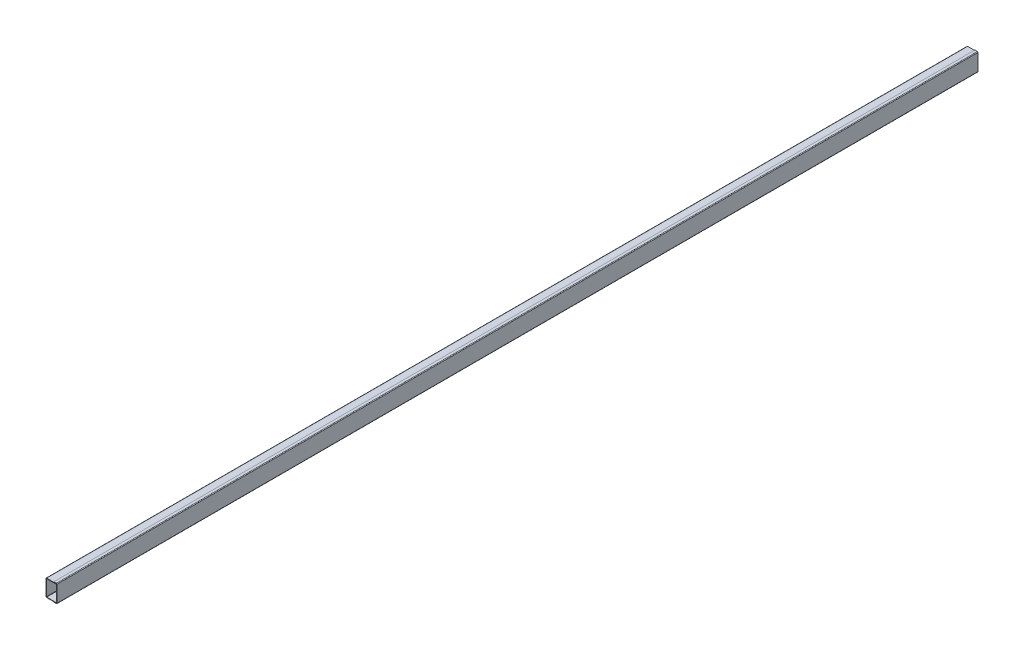
ISO-10303-21;
HEADER;
FILE_DESCRIPTION(('STEP AP214'),'2;1');
FILE_NAME('part.step','',(''),(''),'','','');
FILE_SCHEMA(('AUTOMOTIVE_DESIGN { 1 0 10303 214 1 1 1 1 }'));
ENDSEC;
DATA;
#1=APPLICATION_CONTEXT('core data for automotive mechanical design processes');
#2=APPLICATION_PROTOCOL_DEFINITION('international standard','automotive_design',2000,#1);
#3=PRODUCT_CONTEXT('',#1,'mechanical');
#4=PRODUCT('Part','Part','',(#3));
#5=PRODUCT_RELATED_PRODUCT_CATEGORY('part','',(#4));
#6=PRODUCT_DEFINITION_FORMATION('','',#4);
#7=PRODUCT_DEFINITION_CONTEXT('part definition',#1,'design');
#8=PRODUCT_DEFINITION('design','',#6,#7);
#9=PRODUCT_DEFINITION_SHAPE('','',#8);
#10=(LENGTH_UNIT() NAMED_UNIT(*) SI_UNIT(.MILLI.,.METRE.));
#11=(NAMED_UNIT(*) PLANE_ANGLE_UNIT() SI_UNIT($,.RADIAN.));
#12=(NAMED_UNIT(*) SI_UNIT($,.STERADIAN.) SOLID_ANGLE_UNIT());
#13=UNCERTAINTY_MEASURE_WITH_UNIT(LENGTH_MEASURE(1.E-05),#10,'distance_accuracy_value','');
#14=(GEOMETRIC_REPRESENTATION_CONTEXT(3) GLOBAL_UNCERTAINTY_ASSIGNED_CONTEXT((#13)) GLOBAL_UNIT_ASSIGNED_CONTEXT((#10,
#11,#12)) REPRESENTATION_CONTEXT('',''));
#15=CARTESIAN_POINT('',(0.,0.,0.));
#16=DIRECTION('',(0.,0.,1.));
#17=DIRECTION('',(1.,0.,0.));
#18=AXIS2_PLACEMENT_3D('',#15,#16,#17);
#19=CARTESIAN_POINT('',(52.,40.0000000000002,2185.));
#20=DIRECTION('',(0.,0.,-1.));
#21=DIRECTION('',(-1.,0.,0.));
#22=AXIS2_PLACEMENT_3D('',#19,#20,#21);
#23=PLANE('',#22);
#24=DIRECTION('',(1.,0.,0.));
#25=VECTOR('',#24,1.);
#26=CARTESIAN_POINT('',(50.0000000000002,-38.9999999999998,2185.));
#27=LINE('',#26,#25);
#28=CARTESIAN_POINT('',(50.0000000000002,-38.9999999999998,2185.));
#29=VERTEX_POINT('',#28);
#30=CARTESIAN_POINT('',(52.0000000000002,-38.9999999999998,2185.));
#31=VERTEX_POINT('',#30);
#32=EDGE_CURVE('E230',#29,#31,#27,.T.);
#33=ORIENTED_EDGE('',*,*,#32,.T.);
#34=DIRECTION('',(0.,-1.,0.));
#35=VECTOR('',#34,1.);
#36=CARTESIAN_POINT('',(52.,40.0000000000002,2185.));
#37=LINE('',#36,#35);
#38=CARTESIAN_POINT('',(52.,39.0000000000002,2185.));
#39=VERTEX_POINT('',#38);
#40=EDGE_CURVE('E99',#39,#31,#37,.T.);
#41=ORIENTED_EDGE('',*,*,#40,.F.);
#42=DIRECTION('',(1.,0.,0.));
#43=VECTOR('',#42,1.);
#44=CARTESIAN_POINT('',(50.0000000000001,39.0000000000002,2185.));
#45=LINE('',#44,#43);
#46=CARTESIAN_POINT('',(50.0000000000001,39.0000000000002,2185.));
#47=VERTEX_POINT('',#46);
#48=EDGE_CURVE('E288',#47,#39,#45,.T.);
#49=ORIENTED_EDGE('',*,*,#48,.F.);
#50=DIRECTION('',(0.,-1.,0.));
#51=VECTOR('',#50,1.);
#52=CARTESIAN_POINT('',(50.,40.0000000000002,2185.));
#53=LINE('',#52,#51);
#54=EDGE_CURVE('E290',#47,#29,#53,.T.);
#55=ORIENTED_EDGE('',*,*,#54,.T.);
#56=EDGE_LOOP('',(#33,#41,#49,#55));
#57=FACE_BOUND('',#56,.T.);
#58=ADVANCED_FACE('F91',(#57),#23,.F.);
#59=CARTESIAN_POINT('',(52.0000000000003,-39.9999999999998,-2185.));
#60=DIRECTION('',(0.,0.,1.));
#61=DIRECTION('',(1.,0.,0.));
#62=AXIS2_PLACEMENT_3D('',#59,#60,#61);
#63=PLANE('',#62);
#64=DIRECTION('',(1.,0.,0.));
#65=VECTOR('',#64,1.);
#66=CARTESIAN_POINT('',(50.0000000000002,-38.9999999999998,-2185.));
#67=LINE('',#66,#65);
#68=CARTESIAN_POINT('',(50.0000000000002,-38.9999999999998,-2185.));
#69=VERTEX_POINT('',#68);
#70=CARTESIAN_POINT('',(52.0000000000003,-38.9999999999998,-2185.));
#71=VERTEX_POINT('',#70);
#72=EDGE_CURVE('E237',#69,#71,#67,.T.);
#73=ORIENTED_EDGE('',*,*,#72,.F.);
#74=DIRECTION('',(0.,1.,0.));
#75=VECTOR('',#74,1.);
#76=CARTESIAN_POINT('',(50.0000000000003,-39.9999999999998,-2185.));
#77=LINE('',#76,#75);
#78=CARTESIAN_POINT('',(50.0000000000001,39.0000000000002,-2185.));
#79=VERTEX_POINT('',#78);
#80=EDGE_CURVE('E94',#69,#79,#77,.T.);
#81=ORIENTED_EDGE('',*,*,#80,.T.);
#82=DIRECTION('',(1.,0.,0.));
#83=VECTOR('',#82,1.);
#84=CARTESIAN_POINT('',(50.0000000000001,39.0000000000002,-2185.));
#85=LINE('',#84,#83);
#86=CARTESIAN_POINT('',(52.0000000000001,39.0000000000002,-2185.));
#87=VERTEX_POINT('',#86);
#88=EDGE_CURVE('E278',#79,#87,#85,.T.);
#89=ORIENTED_EDGE('',*,*,#88,.T.);
#90=DIRECTION('',(0.,1.,0.));
#91=VECTOR('',#90,1.);
#92=CARTESIAN_POINT('',(52.0000000000003,-39.9999999999998,-2185.));
#93=LINE('',#92,#91);
#94=EDGE_CURVE('E14',#71,#87,#93,.T.);
#95=ORIENTED_EDGE('',*,*,#94,.F.);
#96=EDGE_LOOP('',(#73,#81,#89,#95));
#97=FACE_BOUND('',#96,.T.);
#98=ADVANCED_FACE('F303',(#97),#63,.F.);
#99=CARTESIAN_POINT('',(52.0000000000001,1.80455310275367E-13,0.));
#100=DIRECTION('',(1.,0.,0.));
#101=DIRECTION('',(0.,1.,0.));
#102=AXIS2_PLACEMENT_3D('',#99,#100,#101);
#103=PLANE('',#102);
#104=ORIENTED_EDGE('',*,*,#40,.T.);
#105=DIRECTION('',(0.,0.,1.));
#106=VECTOR('',#105,1.);
#107=CARTESIAN_POINT('',(52.0000000000002,-38.9999999999998,2185.));
#108=LINE('',#107,#106);
#109=EDGE_CURVE('E185',#31,#71,#108,.F.);
#110=ORIENTED_EDGE('',*,*,#109,.T.);
#111=ORIENTED_EDGE('',*,*,#94,.T.);
#112=DIRECTION('',(0.,0.,-1.));
#113=VECTOR('',#112,1.);
#114=CARTESIAN_POINT('',(52.0000000000001,39.0000000000002,-2185.));
#115=LINE('',#114,#113);
#116=EDGE_CURVE('E273',#87,#39,#115,.F.);
#117=ORIENTED_EDGE('',*,*,#116,.T.);
#118=EDGE_LOOP('',(#104,#110,#111,#117));
#119=FACE_BOUND('',#118,.T.);
#120=ADVANCED_FACE('F336',(#119),#103,.T.);
#121=CARTESIAN_POINT('',(50.0000000000001,1.73472347597681E-13,0.));
#122=DIRECTION('',(1.,0.,0.));
#123=DIRECTION('',(0.,1.,0.));
#124=AXIS2_PLACEMENT_3D('',#121,#122,#123);
#125=PLANE('',#124);
#126=DIRECTION('',(0.,0.,1.));
#127=VECTOR('',#126,1.);
#128=CARTESIAN_POINT('',(50.0000000000002,-38.9999999999998,2185.));
#129=LINE('',#128,#127);
#130=EDGE_CURVE('E234',#29,#69,#129,.F.);
#131=ORIENTED_EDGE('',*,*,#130,.F.);
#132=ORIENTED_EDGE('',*,*,#54,.F.);
#133=DIRECTION('',(0.,0.,-1.));
#134=VECTOR('',#133,1.);
#135=CARTESIAN_POINT('',(50.0000000000001,39.0000000000002,-2185.));
#136=LINE('',#135,#134);
#137=EDGE_CURVE('E284',#79,#47,#136,.F.);
#138=ORIENTED_EDGE('',*,*,#137,.F.);
#139=ORIENTED_EDGE('',*,*,#80,.F.);
#140=EDGE_LOOP('',(#131,#132,#138,#139));
#141=FACE_BOUND('',#140,.T.);
#142=ADVANCED_FACE('F307',(#141),#125,.F.);
#143=CARTESIAN_POINT('',(49.0000000000001,39.0000000000002,2185.));
#144=DIRECTION('',(0.,0.,1.));
#145=DIRECTION('',(1.,0.,0.));
#146=AXIS2_PLACEMENT_3D('',#143,#144,#145);
#147=PLANE('',#146);
#148=DIRECTION('',(0.,1.,0.));
#149=VECTOR('',#148,1.);
#150=CARTESIAN_POINT('',(49.,40.0000000000002,2185.));
#151=LINE('',#150,#149);
#152=CARTESIAN_POINT('',(49.0000000000001,40.0000000000002,2185.));
#153=VERTEX_POINT('',#152);
#154=CARTESIAN_POINT('',(49.0000000000001,42.0000000000002,2185.));
#155=VERTEX_POINT('',#154);
#156=EDGE_CURVE('E239',#153,#155,#151,.T.);
#157=ORIENTED_EDGE('',*,*,#156,.F.);
#158=CARTESIAN_POINT('',(49.0000000000001,39.0000000000002,2185.));
#159=DIRECTION('',(0.,0.,-1.));
#160=DIRECTION('',(-1.,0.,0.));
#161=AXIS2_PLACEMENT_3D('',#158,#159,#160);
#162=CIRCLE('',#161,1.00000000000001);
#163=EDGE_CURVE('E281',#47,#153,#162,.F.);
#164=ORIENTED_EDGE('',*,*,#163,.F.);
#165=ORIENTED_EDGE('',*,*,#48,.T.);
#166=CARTESIAN_POINT('',(49.0000000000001,39.0000000000002,2185.));
#167=DIRECTION('',(0.,0.,-1.));
#168=DIRECTION('',(-1.,0.,0.));
#169=AXIS2_PLACEMENT_3D('',#166,#167,#168);
#170=CIRCLE('',#169,3.00000000000001);
#171=EDGE_CURVE('E115',#39,#155,#170,.F.);
#172=ORIENTED_EDGE('',*,*,#171,.T.);
#173=EDGE_LOOP('',(#157,#164,#165,#172));
#174=FACE_BOUND('',#173,.T.);
#175=ADVANCED_FACE('F314',(#174),#147,.T.);
#176=CARTESIAN_POINT('',(49.0000000000001,39.0000000000002,-2185.));
#177=DIRECTION('',(0.,0.,1.));
#178=DIRECTION('',(1.,0.,0.));
#179=AXIS2_PLACEMENT_3D('',#176,#177,#178);
#180=PLANE('',#179);
#181=CARTESIAN_POINT('',(49.0000000000001,39.0000000000002,-2185.));
#182=DIRECTION('',(0.,0.,-1.));
#183=DIRECTION('',(-1.,0.,0.));
#184=AXIS2_PLACEMENT_3D('',#181,#182,#183);
#185=CIRCLE('',#184,1.00000000000001);
#186=CARTESIAN_POINT('',(49.0000000000001,40.0000000000002,-2185.));
#187=VERTEX_POINT('',#186);
#188=EDGE_CURVE('E270',#187,#79,#185,.T.);
#189=ORIENTED_EDGE('',*,*,#188,.F.);
#190=DIRECTION('',(0.,1.,0.));
#191=VECTOR('',#190,1.);
#192=CARTESIAN_POINT('',(49.0000000000001,40.0000000000002,-2185.));
#193=LINE('',#192,#191);
#194=CARTESIAN_POINT('',(49.0000000000001,42.0000000000002,-2185.));
#195=VERTEX_POINT('',#194);
#196=EDGE_CURVE('E243',#187,#195,#193,.T.);
#197=ORIENTED_EDGE('',*,*,#196,.T.);
#198=CARTESIAN_POINT('',(49.0000000000001,39.0000000000002,-2185.));
#199=DIRECTION('',(0.,0.,-1.));
#200=DIRECTION('',(-1.,0.,0.));
#201=AXIS2_PLACEMENT_3D('',#198,#199,#200);
#202=CIRCLE('',#201,3.00000000000001);
#203=EDGE_CURVE('E276',#195,#87,#202,.T.);
#204=ORIENTED_EDGE('',*,*,#203,.T.);
#205=ORIENTED_EDGE('',*,*,#88,.F.);
#206=EDGE_LOOP('',(#189,#197,#204,#205));
#207=FACE_BOUND('',#206,.T.);
#208=ADVANCED_FACE('F334',(#207),#180,.F.);
#209=CARTESIAN_POINT('',(49.0000000000001,39.0000000000002,-2185.));
#210=DIRECTION('',(0.,0.,-1.));
#211=DIRECTION('',(0.,1.,0.));
#212=AXIS2_PLACEMENT_3D('',#209,#210,#211);
#213=CYLINDRICAL_SURFACE('',#212,3.00000000000001);
#214=ORIENTED_EDGE('',*,*,#116,.F.);
#215=ORIENTED_EDGE('',*,*,#203,.F.);
#216=DIRECTION('',(0.,0.,-1.));
#217=VECTOR('',#216,1.);
#218=CARTESIAN_POINT('',(49.0000000000001,42.0000000000002,0.));
#219=LINE('',#218,#217);
#220=EDGE_CURVE('E246',#155,#195,#219,.T.);
#221=ORIENTED_EDGE('',*,*,#220,.F.);
#222=ORIENTED_EDGE('',*,*,#171,.F.);
#223=EDGE_LOOP('',(#214,#215,#221,#222));
#224=FACE_BOUND('',#223,.T.);
#225=ADVANCED_FACE('F377',(#224),#213,.T.);
#226=CARTESIAN_POINT('',(49.0000000000001,39.0000000000002,-2185.));
#227=DIRECTION('',(0.,0.,-1.));
#228=DIRECTION('',(0.,1.,0.));
#229=AXIS2_PLACEMENT_3D('',#226,#227,#228);
#230=CYLINDRICAL_SURFACE('',#229,1.00000000000001);
#231=ORIENTED_EDGE('',*,*,#137,.T.);
#232=ORIENTED_EDGE('',*,*,#163,.T.);
#233=DIRECTION('',(0.,0.,-1.));
#234=VECTOR('',#233,1.);
#235=CARTESIAN_POINT('',(49.,40.0000000000002,2185.));
#236=LINE('',#235,#234);
#237=EDGE_CURVE('E241',#153,#187,#236,.T.);
#238=ORIENTED_EDGE('',*,*,#237,.T.);
#239=ORIENTED_EDGE('',*,*,#188,.T.);
#240=EDGE_LOOP('',(#231,#232,#238,#239));
#241=FACE_BOUND('',#240,.T.);
#242=ADVANCED_FACE('F310',(#241),#230,.F.);
#243=CARTESIAN_POINT('',(50.,42.0000000000002,-2185.));
#244=DIRECTION('',(0.,0.,-1.));
#245=DIRECTION('',(-1.,0.,0.));
#246=AXIS2_PLACEMENT_3D('',#243,#244,#245);
#247=PLANE('',#246);
#248=DIRECTION('',(1.,0.,0.));
#249=VECTOR('',#248,1.);
#250=CARTESIAN_POINT('',(50.,42.0000000000002,-2185.));
#251=LINE('',#250,#249);
#252=CARTESIAN_POINT('',(37.,42.0000000000002,-2185.));
#253=VERTEX_POINT('',#252);
#254=EDGE_CURVE('E258',#253,#195,#251,.T.);
#255=ORIENTED_EDGE('',*,*,#254,.T.);
#256=ORIENTED_EDGE('',*,*,#196,.F.);
#257=DIRECTION('',(1.,0.,0.));
#258=VECTOR('',#257,1.);
#259=CARTESIAN_POINT('',(50.,40.0000000000002,-2185.));
#260=LINE('',#259,#258);
#261=CARTESIAN_POINT('',(37.,40.0000000000002,-2185.));
#262=VERTEX_POINT('',#261);
#263=EDGE_CURVE('E255',#262,#187,#260,.T.);
#264=ORIENTED_EDGE('',*,*,#263,.F.);
#265=DIRECTION('',(0.,-1.,0.));
#266=VECTOR('',#265,1.);
#267=CARTESIAN_POINT('',(37.,42.0000000000002,-2185.));
#268=LINE('',#267,#266);
#269=EDGE_CURVE('E268',#253,#262,#268,.T.);
#270=ORIENTED_EDGE('',*,*,#269,.F.);
#271=EDGE_LOOP('',(#255,#256,#264,#270));
#272=FACE_BOUND('',#271,.T.);
#273=ADVANCED_FACE('F332',(#272),#247,.T.);
#274=CARTESIAN_POINT('',(37.,42.0000000000002,2185.));
#275=DIRECTION('',(0.,0.,1.));
#276=DIRECTION('',(1.,0.,0.));
#277=AXIS2_PLACEMENT_3D('',#274,#275,#276);
#278=PLANE('',#277);
#279=DIRECTION('',(-1.,0.,0.));
#280=VECTOR('',#279,1.);
#281=CARTESIAN_POINT('',(37.,40.0000000000002,2185.));
#282=LINE('',#281,#280);
#283=CARTESIAN_POINT('',(37.,40.0000000000002,2185.));
#284=VERTEX_POINT('',#283);
#285=EDGE_CURVE('E251',#153,#284,#282,.T.);
#286=ORIENTED_EDGE('',*,*,#285,.F.);
#287=ORIENTED_EDGE('',*,*,#156,.T.);
#288=DIRECTION('',(-1.,0.,0.));
#289=VECTOR('',#288,1.);
#290=CARTESIAN_POINT('',(37.,42.0000000000002,2185.));
#291=LINE('',#290,#289);
#292=CARTESIAN_POINT('',(37.,42.0000000000002,2185.));
#293=VERTEX_POINT('',#292);
#294=EDGE_CURVE('E252',#155,#293,#291,.T.);
#295=ORIENTED_EDGE('',*,*,#294,.T.);
#296=DIRECTION('',(0.,-1.,0.));
#297=VECTOR('',#296,1.);
#298=CARTESIAN_POINT('',(37.,42.0000000000002,2185.));
#299=LINE('',#298,#297);
#300=EDGE_CURVE('E261',#293,#284,#299,.T.);
#301=ORIENTED_EDGE('',*,*,#300,.T.);
#302=EDGE_LOOP('',(#286,#287,#295,#301));
#303=FACE_BOUND('',#302,.T.);
#304=ADVANCED_FACE('F318',(#303),#278,.T.);
#305=CARTESIAN_POINT('',(0.,42.0000000000002,0.));
#306=DIRECTION('',(0.,1.,0.));
#307=DIRECTION('',(0.,0.,1.));
#308=AXIS2_PLACEMENT_3D('',#305,#306,#307);
#309=PLANE('',#308);
#310=ORIENTED_EDGE('',*,*,#294,.F.);
#311=ORIENTED_EDGE('',*,*,#220,.T.);
#312=ORIENTED_EDGE('',*,*,#254,.F.);
#313=DIRECTION('',(0.,0.,-1.));
#314=VECTOR('',#313,1.);
#315=CARTESIAN_POINT('',(37.,42.0000000000002,-2185.));
#316=LINE('',#315,#314);
#317=EDGE_CURVE('E254',#293,#253,#316,.T.);
#318=ORIENTED_EDGE('',*,*,#317,.F.);
#319=EDGE_LOOP('',(#310,#311,#312,#318));
#320=FACE_BOUND('',#319,.T.);
#321=ADVANCED_FACE('F322',(#320),#309,.T.);
#322=CARTESIAN_POINT('',(0.,40.0000000000002,0.));
#323=DIRECTION('',(0.,1.,0.));
#324=DIRECTION('',(0.,0.,1.));
#325=AXIS2_PLACEMENT_3D('',#322,#323,#324);
#326=PLANE('',#325);
#327=ORIENTED_EDGE('',*,*,#237,.F.);
#328=ORIENTED_EDGE('',*,*,#285,.T.);
#329=DIRECTION('',(0.,0.,-1.));
#330=VECTOR('',#329,1.);
#331=CARTESIAN_POINT('',(37.,40.0000000000002,-2185.));
#332=LINE('',#331,#330);
#333=EDGE_CURVE('E263',#284,#262,#332,.T.);
#334=ORIENTED_EDGE('',*,*,#333,.T.);
#335=ORIENTED_EDGE('',*,*,#263,.T.);
#336=EDGE_LOOP('',(#327,#328,#334,#335));
#337=FACE_BOUND('',#336,.T.);
#338=ADVANCED_FACE('F329',(#337),#326,.F.);
#339=CARTESIAN_POINT('',(37.,42.0000000000002,-2185.));
#340=DIRECTION('',(-1.,0.,0.));
#341=DIRECTION('',(0.,-1.,0.));
#342=AXIS2_PLACEMENT_3D('',#339,#340,#341);
#343=PLANE('',#342);
#344=ORIENTED_EDGE('',*,*,#333,.F.);
#345=ORIENTED_EDGE('',*,*,#300,.F.);
#346=ORIENTED_EDGE('',*,*,#317,.T.);
#347=ORIENTED_EDGE('',*,*,#269,.T.);
#348=EDGE_LOOP('',(#344,#345,#346,#347));
#349=FACE_BOUND('',#348,.T.);
#350=ADVANCED_FACE('F326',(#349),#343,.T.);
#351=CARTESIAN_POINT('',(49.0000000000002,-38.9999999999998,-2185.));
#352=DIRECTION('',(0.,0.,-1.));
#353=DIRECTION('',(-1.,0.,0.));
#354=AXIS2_PLACEMENT_3D('',#351,#352,#353);
#355=PLANE('',#354);
#356=DIRECTION('',(0.,-1.,0.));
#357=VECTOR('',#356,1.);
#358=CARTESIAN_POINT('',(49.0000000000003,-39.9999999999998,-2185.));
#359=LINE('',#358,#357);
#360=CARTESIAN_POINT('',(49.0000000000002,-39.9999999999998,-2185.));
#361=VERTEX_POINT('',#360);
#362=CARTESIAN_POINT('',(49.0000000000003,-41.9999999999998,-2185.));
#363=VERTEX_POINT('',#362);
#364=EDGE_CURVE('E344',#361,#363,#359,.T.);
#365=ORIENTED_EDGE('',*,*,#364,.F.);
#366=CARTESIAN_POINT('',(49.0000000000002,-38.9999999999998,-2185.));
#367=DIRECTION('',(0.,0.,1.));
#368=DIRECTION('',(1.,0.,0.));
#369=AXIS2_PLACEMENT_3D('',#366,#367,#368);
#370=CIRCLE('',#369,1.);
#371=EDGE_CURVE('E188',#69,#361,#370,.F.);
#372=ORIENTED_EDGE('',*,*,#371,.F.);
#373=ORIENTED_EDGE('',*,*,#72,.T.);
#374=CARTESIAN_POINT('',(49.0000000000002,-38.9999999999998,-2185.));
#375=DIRECTION('',(0.,0.,1.));
#376=DIRECTION('',(1.,0.,0.));
#377=AXIS2_PLACEMENT_3D('',#374,#375,#376);
#378=CIRCLE('',#377,3.);
#379=EDGE_CURVE('E107',#71,#363,#378,.F.);
#380=ORIENTED_EDGE('',*,*,#379,.T.);
#381=EDGE_LOOP('',(#365,#372,#373,#380));
#382=FACE_BOUND('',#381,.T.);
#383=ADVANCED_FACE('F388',(#382),#355,.T.);
#384=CARTESIAN_POINT('',(49.0000000000002,-38.9999999999998,2185.));
#385=DIRECTION('',(0.,0.,-1.));
#386=DIRECTION('',(-1.,0.,0.));
#387=AXIS2_PLACEMENT_3D('',#384,#385,#386);
#388=PLANE('',#387);
#389=CARTESIAN_POINT('',(49.0000000000002,-38.9999999999998,2185.));
#390=DIRECTION('',(0.,0.,1.));
#391=DIRECTION('',(1.,0.,0.));
#392=AXIS2_PLACEMENT_3D('',#389,#390,#391);
#393=CIRCLE('',#392,1.);
#394=CARTESIAN_POINT('',(49.0000000000002,-39.9999999999998,2185.));
#395=VERTEX_POINT('',#394);
#396=EDGE_CURVE('E195',#395,#29,#393,.T.);
#397=ORIENTED_EDGE('',*,*,#396,.F.);
#398=DIRECTION('',(0.,-1.,0.));
#399=VECTOR('',#398,1.);
#400=CARTESIAN_POINT('',(49.0000000000002,-39.9999999999998,2185.));
#401=LINE('',#400,#399);
#402=CARTESIAN_POINT('',(49.0000000000002,-41.9999999999998,2185.));
#403=VERTEX_POINT('',#402);
#404=EDGE_CURVE('E192',#395,#403,#401,.T.);
#405=ORIENTED_EDGE('',*,*,#404,.T.);
#406=CARTESIAN_POINT('',(49.0000000000002,-38.9999999999998,2185.));
#407=DIRECTION('',(0.,0.,1.));
#408=DIRECTION('',(1.,0.,0.));
#409=AXIS2_PLACEMENT_3D('',#406,#407,#408);
#410=CIRCLE('',#409,3.);
#411=EDGE_CURVE('E179',#403,#31,#410,.T.);
#412=ORIENTED_EDGE('',*,*,#411,.T.);
#413=ORIENTED_EDGE('',*,*,#32,.F.);
#414=EDGE_LOOP('',(#397,#405,#412,#413));
#415=FACE_BOUND('',#414,.T.);
#416=ADVANCED_FACE('F193',(#415),#388,.F.);
#417=CARTESIAN_POINT('',(49.0000000000002,-38.9999999999998,2185.));
#418=DIRECTION('',(0.,0.,1.));
#419=DIRECTION('',(0.,-1.,0.));
#420=AXIS2_PLACEMENT_3D('',#417,#418,#419);
#421=CYLINDRICAL_SURFACE('',#420,3.);
#422=ORIENTED_EDGE('',*,*,#109,.F.);
#423=ORIENTED_EDGE('',*,*,#411,.F.);
#424=DIRECTION('',(0.,0.,-1.));
#425=VECTOR('',#424,1.);
#426=CARTESIAN_POINT('',(49.0000000000003,-41.9999999999998,0.));
#427=LINE('',#426,#425);
#428=EDGE_CURVE('E183',#403,#363,#427,.T.);
#429=ORIENTED_EDGE('',*,*,#428,.T.);
#430=ORIENTED_EDGE('',*,*,#379,.F.);
#431=EDGE_LOOP('',(#422,#423,#429,#430));
#432=FACE_BOUND('',#431,.T.);
#433=ADVANCED_FACE('F181',(#432),#421,.T.);
#434=CARTESIAN_POINT('',(49.0000000000002,-38.9999999999998,2185.));
#435=DIRECTION('',(0.,0.,1.));
#436=DIRECTION('',(0.,-1.,0.));
#437=AXIS2_PLACEMENT_3D('',#434,#435,#436);
#438=CYLINDRICAL_SURFACE('',#437,1.);
#439=ORIENTED_EDGE('',*,*,#130,.T.);
#440=ORIENTED_EDGE('',*,*,#371,.T.);
#441=DIRECTION('',(0.,0.,1.));
#442=VECTOR('',#441,1.);
#443=CARTESIAN_POINT('',(49.0000000000003,-39.9999999999998,-2185.));
#444=LINE('',#443,#442);
#445=EDGE_CURVE('E200',#361,#395,#444,.T.);
#446=ORIENTED_EDGE('',*,*,#445,.T.);
#447=ORIENTED_EDGE('',*,*,#396,.T.);
#448=EDGE_LOOP('',(#439,#440,#446,#447));
#449=FACE_BOUND('',#448,.T.);
#450=ADVANCED_FACE('F339',(#449),#438,.F.);
#451=CARTESIAN_POINT('',(50.0000000000003,-41.9999999999998,-2185.));
#452=DIRECTION('',(0.,0.,-1.));
#453=DIRECTION('',(-1.,0.,0.));
#454=AXIS2_PLACEMENT_3D('',#451,#452,#453);
#455=PLANE('',#454);
#456=DIRECTION('',(-1.,0.,0.));
#457=VECTOR('',#456,1.);
#458=CARTESIAN_POINT('',(50.0000000000003,-39.9999999999998,-2185.));
#459=LINE('',#458,#457);
#460=CARTESIAN_POINT('',(37.0000000000003,-39.9999999999999,-2185.));
#461=VERTEX_POINT('',#460);
#462=EDGE_CURVE('E210',#361,#461,#459,.T.);
#463=ORIENTED_EDGE('',*,*,#462,.F.);
#464=ORIENTED_EDGE('',*,*,#364,.T.);
#465=DIRECTION('',(-1.,0.,0.));
#466=VECTOR('',#465,1.);
#467=CARTESIAN_POINT('',(50.0000000000003,-41.9999999999998,-2185.));
#468=LINE('',#467,#466);
#469=CARTESIAN_POINT('',(37.0000000000003,-41.9999999999999,-2185.));
#470=VERTEX_POINT('',#469);
#471=EDGE_CURVE('E209',#363,#470,#468,.T.);
#472=ORIENTED_EDGE('',*,*,#471,.T.);
#473=DIRECTION('',(0.,1.,0.));
#474=VECTOR('',#473,1.);
#475=CARTESIAN_POINT('',(37.0000000000003,-41.9999999999999,-2185.));
#476=LINE('',#475,#474);
#477=EDGE_CURVE('E214',#470,#461,#476,.T.);
#478=ORIENTED_EDGE('',*,*,#477,.T.);
#479=EDGE_LOOP('',(#463,#464,#472,#478));
#480=FACE_BOUND('',#479,.T.);
#481=ADVANCED_FACE('F350',(#480),#455,.T.);
#482=CARTESIAN_POINT('',(37.0000000000003,-41.9999999999999,2185.));
#483=DIRECTION('',(0.,0.,1.));
#484=DIRECTION('',(1.,0.,0.));
#485=AXIS2_PLACEMENT_3D('',#482,#483,#484);
#486=PLANE('',#485);
#487=DIRECTION('',(1.,0.,0.));
#488=VECTOR('',#487,1.);
#489=CARTESIAN_POINT('',(37.0000000000003,-41.9999999999999,2185.));
#490=LINE('',#489,#488);
#491=CARTESIAN_POINT('',(37.0000000000003,-41.9999999999999,2185.));
#492=VERTEX_POINT('',#491);
#493=EDGE_CURVE('E207',#492,#403,#490,.T.);
#494=ORIENTED_EDGE('',*,*,#493,.T.);
#495=ORIENTED_EDGE('',*,*,#404,.F.);
#496=DIRECTION('',(1.,0.,0.));
#497=VECTOR('',#496,1.);
#498=CARTESIAN_POINT('',(37.0000000000003,-39.9999999999999,2185.));
#499=LINE('',#498,#497);
#500=CARTESIAN_POINT('',(37.0000000000003,-39.9999999999999,2185.));
#501=VERTEX_POINT('',#500);
#502=EDGE_CURVE('E226',#501,#395,#499,.T.);
#503=ORIENTED_EDGE('',*,*,#502,.F.);
#504=DIRECTION('',(0.,1.,0.));
#505=VECTOR('',#504,1.);
#506=CARTESIAN_POINT('',(37.0000000000003,-41.9999999999999,2185.));
#507=LINE('',#506,#505);
#508=EDGE_CURVE('E213',#492,#501,#507,.T.);
#509=ORIENTED_EDGE('',*,*,#508,.F.);
#510=EDGE_LOOP('',(#494,#495,#503,#509));
#511=FACE_BOUND('',#510,.T.);
#512=ADVANCED_FACE('F212',(#511),#486,.T.);
#513=CARTESIAN_POINT('',(2.91477612737884E-13,-42.0000000000002,0.));
#514=DIRECTION('',(0.,1.,0.));
#515=DIRECTION('',(-1.,0.,0.));
#516=AXIS2_PLACEMENT_3D('',#513,#514,#515);
#517=PLANE('',#516);
#518=ORIENTED_EDGE('',*,*,#428,.F.);
#519=ORIENTED_EDGE('',*,*,#493,.F.);
#520=DIRECTION('',(0.,0.,1.));
#521=VECTOR('',#520,1.);
#522=CARTESIAN_POINT('',(37.0000000000003,-41.9999999999999,-2185.));
#523=LINE('',#522,#521);
#524=EDGE_CURVE('E215',#470,#492,#523,.T.);
#525=ORIENTED_EDGE('',*,*,#524,.F.);
#526=ORIENTED_EDGE('',*,*,#471,.F.);
#527=EDGE_LOOP('',(#518,#519,#525,#526));
#528=FACE_BOUND('',#527,.T.);
#529=ADVANCED_FACE('F205',(#528),#517,.F.);
#530=CARTESIAN_POINT('',(2.7755575615629E-13,-40.0000000000002,0.));
#531=DIRECTION('',(0.,1.,0.));
#532=DIRECTION('',(-1.,0.,0.));
#533=AXIS2_PLACEMENT_3D('',#530,#531,#532);
#534=PLANE('',#533);
#535=ORIENTED_EDGE('',*,*,#502,.T.);
#536=ORIENTED_EDGE('',*,*,#445,.F.);
#537=ORIENTED_EDGE('',*,*,#462,.T.);
#538=DIRECTION('',(0.,0.,1.));
#539=VECTOR('',#538,1.);
#540=CARTESIAN_POINT('',(37.0000000000003,-39.9999999999999,-2185.));
#541=LINE('',#540,#539);
#542=EDGE_CURVE('E223',#461,#501,#541,.T.);
#543=ORIENTED_EDGE('',*,*,#542,.T.);
#544=EDGE_LOOP('',(#535,#536,#537,#543));
#545=FACE_BOUND('',#544,.T.);
#546=ADVANCED_FACE('F354',(#545),#534,.T.);
#547=CARTESIAN_POINT('',(37.0000000000003,-41.9999999999999,-2185.));
#548=DIRECTION('',(-1.,0.,0.));
#549=DIRECTION('',(0.,-1.,0.));
#550=AXIS2_PLACEMENT_3D('',#547,#548,#549);
#551=PLANE('',#550);
#552=ORIENTED_EDGE('',*,*,#542,.F.);
#553=ORIENTED_EDGE('',*,*,#477,.F.);
#554=ORIENTED_EDGE('',*,*,#524,.T.);
#555=ORIENTED_EDGE('',*,*,#508,.T.);
#556=EDGE_LOOP('',(#552,#553,#554,#555));
#557=FACE_BOUND('',#556,.T.);
#558=ADVANCED_FACE('F353',(#557),#551,.T.);
#559=CLOSED_SHELL('',(#58,#98,#120,#142,#175,#208,#225,#242,#273,#304,#321,#338,#350,#383,#416,
#433,#450,#481,#512,#529,#546,#558));
#560=MANIFOLD_SOLID_BREP('B2',#559);
#561=CARTESIAN_POINT('',(2.,-40.,-2185.));
#562=DIRECTION('',(0.,0.,1.));
#563=DIRECTION('',(1.,0.,0.));
#564=AXIS2_PLACEMENT_3D('',#561,#562,#563);
#565=PLANE('',#564);
#566=DIRECTION('',(-1.,0.,0.));
#567=VECTOR('',#566,1.);
#568=CARTESIAN_POINT('',(2.00000000000004,-37.,-2185.));
#569=LINE('',#568,#567);
#570=CARTESIAN_POINT('',(2.00000000000004,-37.,-2185.));
#571=VERTEX_POINT('',#570);
#572=CARTESIAN_POINT('',(0.,-37.,-2185.));
#573=VERTEX_POINT('',#572);
#574=EDGE_CURVE('E722',#571,#573,#569,.T.);
#575=ORIENTED_EDGE('',*,*,#574,.T.);
#576=DIRECTION('',(0.,1.,0.));
#577=VECTOR('',#576,1.);
#578=CARTESIAN_POINT('',(0.,-40.,-2185.));
#579=LINE('',#578,#577);
#580=CARTESIAN_POINT('',(0.,37.,-2185.));
#581=VERTEX_POINT('',#580);
#582=EDGE_CURVE('E782',#573,#581,#579,.T.);
#583=ORIENTED_EDGE('',*,*,#582,.T.);
#584=DIRECTION('',(-1.,0.,0.));
#585=VECTOR('',#584,1.);
#586=CARTESIAN_POINT('',(1.99999999999996,37.,-2185.));
#587=LINE('',#586,#585);
#588=CARTESIAN_POINT('',(1.99999999999996,37.,-2185.));
#589=VERTEX_POINT('',#588);
#590=EDGE_CURVE('E780',#589,#581,#587,.T.);
#591=ORIENTED_EDGE('',*,*,#590,.F.);
#592=DIRECTION('',(0.,1.,0.));
#593=VECTOR('',#592,1.);
#594=CARTESIAN_POINT('',(2.,-40.,-2185.));
#595=LINE('',#594,#593);
#596=EDGE_CURVE('E587',#571,#589,#595,.T.);
#597=ORIENTED_EDGE('',*,*,#596,.F.);
#598=EDGE_LOOP('',(#575,#583,#591,#597));
#599=FACE_BOUND('',#598,.T.);
#600=ADVANCED_FACE('F579',(#599),#565,.F.);
#601=CARTESIAN_POINT('',(2.,-40.,2185.));
#602=DIRECTION('',(0.,0.,-1.));
#603=DIRECTION('',(-1.,0.,0.));
#604=AXIS2_PLACEMENT_3D('',#601,#602,#603);
#605=PLANE('',#604);
#606=DIRECTION('',(-1.,0.,0.));
#607=VECTOR('',#606,1.);
#608=CARTESIAN_POINT('',(2.00000000000004,-37.,2185.));
#609=LINE('',#608,#607);
#610=CARTESIAN_POINT('',(2.00000000000004,-37.,2185.));
#611=VERTEX_POINT('',#610);
#612=CARTESIAN_POINT('',(0.,-37.,2185.));
#613=VERTEX_POINT('',#612);
#614=EDGE_CURVE('E729',#611,#613,#609,.T.);
#615=ORIENTED_EDGE('',*,*,#614,.F.);
#616=DIRECTION('',(0.,-1.,0.));
#617=VECTOR('',#616,1.);
#618=CARTESIAN_POINT('',(2.,-40.,2185.));
#619=LINE('',#618,#617);
#620=CARTESIAN_POINT('',(1.99999999999996,37.,2185.));
#621=VERTEX_POINT('',#620);
#622=EDGE_CURVE('E89',#621,#611,#619,.T.);
#623=ORIENTED_EDGE('',*,*,#622,.F.);
#624=DIRECTION('',(-1.,0.,0.));
#625=VECTOR('',#624,1.);
#626=CARTESIAN_POINT('',(1.99999999999996,37.,2185.));
#627=LINE('',#626,#625);
#628=CARTESIAN_POINT('',(0.,37.,2185.));
#629=VERTEX_POINT('',#628);
#630=EDGE_CURVE('E770',#621,#629,#627,.T.);
#631=ORIENTED_EDGE('',*,*,#630,.T.);
#632=DIRECTION('',(0.,-1.,0.));
#633=VECTOR('',#632,1.);
#634=CARTESIAN_POINT('',(0.,-40.,2185.));
#635=LINE('',#634,#633);
#636=EDGE_CURVE('E582',#629,#613,#635,.T.);
#637=ORIENTED_EDGE('',*,*,#636,.T.);
#638=EDGE_LOOP('',(#615,#623,#631,#637));
#639=FACE_BOUND('',#638,.T.);
#640=ADVANCED_FACE('F794',(#639),#605,.F.);
#641=CARTESIAN_POINT('',(2.,0.,0.));
#642=DIRECTION('',(-1.,0.,0.));
#643=DIRECTION('',(0.,0.,1.));
#644=AXIS2_PLACEMENT_3D('',#641,#642,#643);
#645=PLANE('',#644);
#646=DIRECTION('',(0.,0.,-1.));
#647=VECTOR('',#646,1.);
#648=CARTESIAN_POINT('',(2.00000000000004,-37.,-2185.));
#649=LINE('',#648,#647);
#650=EDGE_CURVE('E726',#571,#611,#649,.F.);
#651=ORIENTED_EDGE('',*,*,#650,.F.);
#652=ORIENTED_EDGE('',*,*,#596,.T.);
#653=DIRECTION('',(0.,0.,1.));
#654=VECTOR('',#653,1.);
#655=CARTESIAN_POINT('',(1.99999999999996,37.,2185.));
#656=LINE('',#655,#654);
#657=EDGE_CURVE('E776',#621,#589,#656,.F.);
#658=ORIENTED_EDGE('',*,*,#657,.F.);
#659=ORIENTED_EDGE('',*,*,#622,.T.);
#660=EDGE_LOOP('',(#651,#652,#658,#659));
#661=FACE_BOUND('',#660,.T.);
#662=ADVANCED_FACE('F841',(#661),#645,.F.);
#663=CARTESIAN_POINT('',(0.,0.,0.));
#664=DIRECTION('',(-1.,0.,0.));
#665=DIRECTION('',(0.,0.,1.));
#666=AXIS2_PLACEMENT_3D('',#663,#664,#665);
#667=PLANE('',#666);
#668=ORIENTED_EDGE('',*,*,#582,.F.);
#669=DIRECTION('',(0.,0.,-1.));
#670=VECTOR('',#669,1.);
#671=CARTESIAN_POINT('',(0.,-37.,-2185.));
#672=LINE('',#671,#670);
#673=EDGE_CURVE('E673',#573,#613,#672,.F.);
#674=ORIENTED_EDGE('',*,*,#673,.T.);
#675=ORIENTED_EDGE('',*,*,#636,.F.);
#676=DIRECTION('',(0.,0.,1.));
#677=VECTOR('',#676,1.);
#678=CARTESIAN_POINT('',(0.,37.,2185.));
#679=LINE('',#678,#677);
#680=EDGE_CURVE('E765',#629,#581,#679,.F.);
#681=ORIENTED_EDGE('',*,*,#680,.T.);
#682=EDGE_LOOP('',(#668,#674,#675,#681));
#683=FACE_BOUND('',#682,.T.);
#684=ADVANCED_FACE('F797',(#683),#667,.T.);
#685=CARTESIAN_POINT('',(2.99999999999996,37.,-2185.));
#686=DIRECTION('',(0.,0.,-1.));
#687=DIRECTION('',(-1.,0.,0.));
#688=AXIS2_PLACEMENT_3D('',#685,#686,#687);
#689=PLANE('',#688);
#690=DIRECTION('',(0.,1.,0.));
#691=VECTOR('',#690,1.);
#692=CARTESIAN_POINT('',(2.99999999999999,40.,-2185.));
#693=LINE('',#692,#691);
#694=CARTESIAN_POINT('',(2.99999999999995,38.,-2185.));
#695=VERTEX_POINT('',#694);
#696=CARTESIAN_POINT('',(2.99999999999995,40.,-2185.));
#697=VERTEX_POINT('',#696);
#698=EDGE_CURVE('E731',#695,#697,#693,.T.);
#699=ORIENTED_EDGE('',*,*,#698,.F.);
#700=CARTESIAN_POINT('',(2.99999999999996,37.,-2185.));
#701=DIRECTION('',(0.,0.,1.));
#702=DIRECTION('',(1.,0.,0.));
#703=AXIS2_PLACEMENT_3D('',#700,#701,#702);
#704=CIRCLE('',#703,1.);
#705=EDGE_CURVE('E773',#589,#695,#704,.F.);
#706=ORIENTED_EDGE('',*,*,#705,.F.);
#707=ORIENTED_EDGE('',*,*,#590,.T.);
#708=CARTESIAN_POINT('',(2.99999999999996,37.,-2185.));
#709=DIRECTION('',(0.,0.,1.));
#710=DIRECTION('',(1.,0.,0.));
#711=AXIS2_PLACEMENT_3D('',#708,#709,#710);
#712=CIRCLE('',#711,3.);
#713=EDGE_CURVE('E603',#581,#697,#712,.F.);
#714=ORIENTED_EDGE('',*,*,#713,.T.);
#715=EDGE_LOOP('',(#699,#706,#707,#714));
#716=FACE_BOUND('',#715,.T.);
#717=ADVANCED_FACE('F820',(#716),#689,.T.);
#718=CARTESIAN_POINT('',(2.99999999999996,37.,2185.));
#719=DIRECTION('',(0.,0.,-1.));
#720=DIRECTION('',(-1.,0.,0.));
#721=AXIS2_PLACEMENT_3D('',#718,#719,#720);
#722=PLANE('',#721);
#723=CARTESIAN_POINT('',(2.99999999999996,37.,2185.));
#724=DIRECTION('',(0.,0.,1.));
#725=DIRECTION('',(1.,0.,0.));
#726=AXIS2_PLACEMENT_3D('',#723,#724,#725);
#727=CIRCLE('',#726,1.);
#728=CARTESIAN_POINT('',(2.99999999999995,38.,2185.));
#729=VERTEX_POINT('',#728);
#730=EDGE_CURVE('E735',#729,#621,#727,.T.);
#731=ORIENTED_EDGE('',*,*,#730,.F.);
#732=DIRECTION('',(0.,1.,0.));
#733=VECTOR('',#732,1.);
#734=CARTESIAN_POINT('',(2.99999999999991,38.,2185.));
#735=LINE('',#734,#733);
#736=CARTESIAN_POINT('',(2.99999999999991,40.,2185.));
#737=VERTEX_POINT('',#736);
#738=EDGE_CURVE('E758',#729,#737,#735,.T.);
#739=ORIENTED_EDGE('',*,*,#738,.T.);
#740=CARTESIAN_POINT('',(2.99999999999996,37.,2185.));
#741=DIRECTION('',(0.,0.,1.));
#742=DIRECTION('',(1.,0.,0.));
#743=AXIS2_PLACEMENT_3D('',#740,#741,#742);
#744=CIRCLE('',#743,3.);
#745=EDGE_CURVE('E768',#737,#629,#744,.T.);
#746=ORIENTED_EDGE('',*,*,#745,.T.);
#747=ORIENTED_EDGE('',*,*,#630,.F.);
#748=EDGE_LOOP('',(#731,#739,#746,#747));
#749=FACE_BOUND('',#748,.T.);
#750=ADVANCED_FACE('F801',(#749),#722,.F.);
#751=CARTESIAN_POINT('',(2.99999999999996,37.,2185.));
#752=DIRECTION('',(0.,0.,1.));
#753=DIRECTION('',(0.,1.,0.));
#754=AXIS2_PLACEMENT_3D('',#751,#752,#753);
#755=CYLINDRICAL_SURFACE('',#754,3.);
#756=ORIENTED_EDGE('',*,*,#680,.F.);
#757=ORIENTED_EDGE('',*,*,#745,.F.);
#758=DIRECTION('',(0.,0.,1.));
#759=VECTOR('',#758,1.);
#760=CARTESIAN_POINT('',(2.99999999999995,40.,0.));
#761=LINE('',#760,#759);
#762=EDGE_CURVE('E755',#697,#737,#761,.T.);
#763=ORIENTED_EDGE('',*,*,#762,.F.);
#764=ORIENTED_EDGE('',*,*,#713,.F.);
#765=EDGE_LOOP('',(#756,#757,#763,#764));
#766=FACE_BOUND('',#765,.T.);
#767=ADVANCED_FACE('F798',(#766),#755,.T.);
#768=CARTESIAN_POINT('',(2.99999999999996,37.,2185.));
#769=DIRECTION('',(0.,0.,1.));
#770=DIRECTION('',(0.,1.,0.));
#771=AXIS2_PLACEMENT_3D('',#768,#769,#770);
#772=CYLINDRICAL_SURFACE('',#771,1.);
#773=ORIENTED_EDGE('',*,*,#657,.T.);
#774=ORIENTED_EDGE('',*,*,#705,.T.);
#775=DIRECTION('',(0.,0.,-1.));
#776=VECTOR('',#775,1.);
#777=CARTESIAN_POINT('',(3.,38.,-2185.));
#778=LINE('',#777,#776);
#779=EDGE_CURVE('E761',#695,#729,#778,.F.);
#780=ORIENTED_EDGE('',*,*,#779,.T.);
#781=ORIENTED_EDGE('',*,*,#730,.T.);
#782=EDGE_LOOP('',(#773,#774,#780,#781));
#783=FACE_BOUND('',#782,.T.);
#784=ADVANCED_FACE('F823',(#783),#772,.F.);
#785=CARTESIAN_POINT('',(1.99999999999999,40.,2185.));
#786=DIRECTION('',(0.,0.,1.));
#787=DIRECTION('',(1.,0.,0.));
#788=AXIS2_PLACEMENT_3D('',#785,#786,#787);
#789=PLANE('',#788);
#790=DIRECTION('',(-1.,0.,0.));
#791=VECTOR('',#790,1.);
#792=CARTESIAN_POINT('',(1.99999999999999,40.,2185.));
#793=LINE('',#792,#791);
#794=CARTESIAN_POINT('',(50.,40.0000000000002,2185.));
#795=VERTEX_POINT('',#794);
#796=EDGE_CURVE('E739',#795,#737,#793,.T.);
#797=ORIENTED_EDGE('',*,*,#796,.T.);
#798=ORIENTED_EDGE('',*,*,#738,.F.);
#799=DIRECTION('',(1.,0.,0.));
#800=VECTOR('',#799,1.);
#801=CARTESIAN_POINT('',(-1.38777878078145E-13,38.,2185.));
#802=LINE('',#801,#800);
#803=CARTESIAN_POINT('',(50.,38.0000000000002,2185.));
#804=VERTEX_POINT('',#803);
#805=EDGE_CURVE('E747',#804,#729,#802,.F.);
#806=ORIENTED_EDGE('',*,*,#805,.F.);
#807=DIRECTION('',(0.,-1.,0.));
#808=VECTOR('',#807,1.);
#809=CARTESIAN_POINT('',(50.,40.0000000000002,2185.));
#810=LINE('',#809,#808);
#811=EDGE_CURVE('E733',#795,#804,#810,.T.);
#812=ORIENTED_EDGE('',*,*,#811,.F.);
#813=EDGE_LOOP('',(#797,#798,#806,#812));
#814=FACE_BOUND('',#813,.T.);
#815=ADVANCED_FACE('F810',(#814),#789,.T.);
#816=CARTESIAN_POINT('',(50.,40.0000000000002,-2185.));
#817=DIRECTION('',(0.,0.,-1.));
#818=DIRECTION('',(-1.,0.,0.));
#819=AXIS2_PLACEMENT_3D('',#816,#817,#818);
#820=PLANE('',#819);
#821=DIRECTION('',(-1.,0.,0.));
#822=VECTOR('',#821,1.);
#823=CARTESIAN_POINT('',(-1.38777878078145E-13,38.,-2185.));
#824=LINE('',#823,#822);
#825=CARTESIAN_POINT('',(50.,38.0000000000002,-2185.));
#826=VERTEX_POINT('',#825);
#827=EDGE_CURVE('E753',#695,#826,#824,.F.);
#828=ORIENTED_EDGE('',*,*,#827,.F.);
#829=ORIENTED_EDGE('',*,*,#698,.T.);
#830=DIRECTION('',(1.,0.,0.));
#831=VECTOR('',#830,1.);
#832=CARTESIAN_POINT('',(50.,40.0000000000002,-2185.));
#833=LINE('',#832,#831);
#834=CARTESIAN_POINT('',(50.,40.0000000000002,-2185.));
#835=VERTEX_POINT('',#834);
#836=EDGE_CURVE('E745',#697,#835,#833,.T.);
#837=ORIENTED_EDGE('',*,*,#836,.T.);
#838=DIRECTION('',(0.,-1.,0.));
#839=VECTOR('',#838,1.);
#840=CARTESIAN_POINT('',(50.,40.0000000000002,-2185.));
#841=LINE('',#840,#839);
#842=EDGE_CURVE('E736',#835,#826,#841,.T.);
#843=ORIENTED_EDGE('',*,*,#842,.T.);
#844=EDGE_LOOP('',(#828,#829,#837,#843));
#845=FACE_BOUND('',#844,.T.);
#846=ADVANCED_FACE('F817',(#845),#820,.T.);
#847=CARTESIAN_POINT('',(-1.45760840755831E-13,40.,0.));
#848=DIRECTION('',(0.,1.,0.));
#849=DIRECTION('',(-1.,0.,0.));
#850=AXIS2_PLACEMENT_3D('',#847,#848,#849);
#851=PLANE('',#850);
#852=ORIENTED_EDGE('',*,*,#836,.F.);
#853=ORIENTED_EDGE('',*,*,#762,.T.);
#854=ORIENTED_EDGE('',*,*,#796,.F.);
#855=DIRECTION('',(0.,0.,1.));
#856=VECTOR('',#855,1.);
#857=CARTESIAN_POINT('',(50.,40.0000000000002,2185.));
#858=LINE('',#857,#856);
#859=EDGE_CURVE('E742',#835,#795,#858,.T.);
#860=ORIENTED_EDGE('',*,*,#859,.F.);
#861=EDGE_LOOP('',(#852,#853,#854,#860));
#862=FACE_BOUND('',#861,.T.);
#863=ADVANCED_FACE('F808',(#862),#851,.T.);
#864=CARTESIAN_POINT('',(-1.38777878078145E-13,38.,0.));
#865=DIRECTION('',(0.,1.,0.));
#866=DIRECTION('',(-1.,0.,0.));
#867=AXIS2_PLACEMENT_3D('',#864,#865,#866);
#868=PLANE('',#867);
#869=ORIENTED_EDGE('',*,*,#779,.F.);
#870=ORIENTED_EDGE('',*,*,#827,.T.);
#871=DIRECTION('',(0.,0.,-1.));
#872=VECTOR('',#871,1.);
#873=CARTESIAN_POINT('',(50.,38.0000000000002,0.));
#874=LINE('',#873,#872);
#875=EDGE_CURVE('E750',#826,#804,#874,.F.);
#876=ORIENTED_EDGE('',*,*,#875,.T.);
#877=ORIENTED_EDGE('',*,*,#805,.T.);
#878=EDGE_LOOP('',(#869,#870,#876,#877));
#879=FACE_BOUND('',#878,.T.);
#880=ADVANCED_FACE('F826',(#879),#868,.F.);
#881=CARTESIAN_POINT('',(50.,40.0000000000002,2185.));
#882=DIRECTION('',(1.,0.,0.));
#883=DIRECTION('',(0.,1.,0.));
#884=AXIS2_PLACEMENT_3D('',#881,#882,#883);
#885=PLANE('',#884);
#886=ORIENTED_EDGE('',*,*,#875,.F.);
#887=ORIENTED_EDGE('',*,*,#842,.F.);
#888=ORIENTED_EDGE('',*,*,#859,.T.);
#889=ORIENTED_EDGE('',*,*,#811,.T.);
#890=EDGE_LOOP('',(#886,#887,#888,#889));
#891=FACE_BOUND('',#890,.T.);
#892=ADVANCED_FACE('F814',(#891),#885,.T.);
#893=CARTESIAN_POINT('',(3.00000000000004,-37.,2185.));
#894=DIRECTION('',(0.,0.,1.));
#895=DIRECTION('',(1.,0.,0.));
#896=AXIS2_PLACEMENT_3D('',#893,#894,#895);
#897=PLANE('',#896);
#898=DIRECTION('',(0.,-1.,0.));
#899=VECTOR('',#898,1.);
#900=CARTESIAN_POINT('',(2.99999999999999,-40.,2185.));
#901=LINE('',#900,#899);
#902=CARTESIAN_POINT('',(3.00000000000004,-38.,2185.));
#903=VERTEX_POINT('',#902);
#904=CARTESIAN_POINT('',(3.00000000000003,-40.,2185.));
#905=VERTEX_POINT('',#904);
#906=EDGE_CURVE('E718',#903,#905,#901,.T.);
#907=ORIENTED_EDGE('',*,*,#906,.F.);
#908=CARTESIAN_POINT('',(3.00000000000004,-37.,2185.));
#909=DIRECTION('',(0.,0.,-1.));
#910=DIRECTION('',(-1.,0.,0.));
#911=AXIS2_PLACEMENT_3D('',#908,#909,#910);
#912=CIRCLE('',#911,1.);
#913=EDGE_CURVE('E676',#611,#903,#912,.F.);
#914=ORIENTED_EDGE('',*,*,#913,.F.);
#915=ORIENTED_EDGE('',*,*,#614,.T.);
#916=CARTESIAN_POINT('',(3.00000000000004,-37.,2185.));
#917=DIRECTION('',(0.,0.,-1.));
#918=DIRECTION('',(-1.,0.,0.));
#919=AXIS2_PLACEMENT_3D('',#916,#917,#918);
#920=CIRCLE('',#919,3.);
#921=EDGE_CURVE('E595',#613,#905,#920,.F.);
#922=ORIENTED_EDGE('',*,*,#921,.T.);
#923=EDGE_LOOP('',(#907,#914,#915,#922));
#924=FACE_BOUND('',#923,.T.);
#925=ADVANCED_FACE('F833',(#924),#897,.T.);
#926=CARTESIAN_POINT('',(3.00000000000004,-37.,-2185.));
#927=DIRECTION('',(0.,0.,1.));
#928=DIRECTION('',(1.,0.,0.));
#929=AXIS2_PLACEMENT_3D('',#926,#927,#928);
#930=PLANE('',#929);
#931=CARTESIAN_POINT('',(3.00000000000004,-37.,-2185.));
#932=DIRECTION('',(0.,0.,-1.));
#933=DIRECTION('',(-1.,0.,0.));
#934=AXIS2_PLACEMENT_3D('',#931,#932,#933);
#935=CIRCLE('',#934,1.);
#936=CARTESIAN_POINT('',(3.00000000000004,-38.,-2185.));
#937=VERTEX_POINT('',#936);
#938=EDGE_CURVE('E683',#937,#571,#935,.T.);
#939=ORIENTED_EDGE('',*,*,#938,.F.);
#940=DIRECTION('',(0.,-1.,0.));
#941=VECTOR('',#940,1.);
#942=CARTESIAN_POINT('',(3.00000000000008,-38.,-2185.));
#943=LINE('',#942,#941);
#944=CARTESIAN_POINT('',(3.00000000000007,-40.,-2185.));
#945=VERTEX_POINT('',#944);
#946=EDGE_CURVE('E680',#937,#945,#943,.T.);
#947=ORIENTED_EDGE('',*,*,#946,.T.);
#948=CARTESIAN_POINT('',(3.00000000000004,-37.,-2185.));
#949=DIRECTION('',(0.,0.,-1.));
#950=DIRECTION('',(-1.,0.,0.));
#951=AXIS2_PLACEMENT_3D('',#948,#949,#950);
#952=CIRCLE('',#951,3.);
#953=EDGE_CURVE('E667',#945,#573,#952,.T.);
#954=ORIENTED_EDGE('',*,*,#953,.T.);
#955=ORIENTED_EDGE('',*,*,#574,.F.);
#956=EDGE_LOOP('',(#939,#947,#954,#955));
#957=FACE_BOUND('',#956,.T.);
#958=ADVANCED_FACE('F681',(#957),#930,.F.);
#959=CARTESIAN_POINT('',(3.00000000000004,-37.,-2185.));
#960=DIRECTION('',(0.,0.,-1.));
#961=DIRECTION('',(0.,-1.,0.));
#962=AXIS2_PLACEMENT_3D('',#959,#960,#961);
#963=CYLINDRICAL_SURFACE('',#962,3.);
#964=ORIENTED_EDGE('',*,*,#673,.F.);
#965=ORIENTED_EDGE('',*,*,#953,.F.);
#966=DIRECTION('',(0.,0.,-1.));
#967=VECTOR('',#966,1.);
#968=CARTESIAN_POINT('',(3.00000000000003,-40.,0.));
#969=LINE('',#968,#967);
#970=EDGE_CURVE('E671',#905,#945,#969,.T.);
#971=ORIENTED_EDGE('',*,*,#970,.F.);
#972=ORIENTED_EDGE('',*,*,#921,.F.);
#973=EDGE_LOOP('',(#964,#965,#971,#972));
#974=FACE_BOUND('',#973,.T.);
#975=ADVANCED_FACE('F669',(#974),#963,.T.);
#976=CARTESIAN_POINT('',(3.00000000000004,-37.,-2185.));
#977=DIRECTION('',(0.,0.,-1.));
#978=DIRECTION('',(0.,-1.,0.));
#979=AXIS2_PLACEMENT_3D('',#976,#977,#978);
#980=CYLINDRICAL_SURFACE('',#979,1.);
#981=ORIENTED_EDGE('',*,*,#650,.T.);
#982=ORIENTED_EDGE('',*,*,#913,.T.);
#983=DIRECTION('',(0.,0.,1.));
#984=VECTOR('',#983,1.);
#985=CARTESIAN_POINT('',(3.,-38.,2185.));
#986=LINE('',#985,#984);
#987=EDGE_CURVE('E688',#903,#937,#986,.F.);
#988=ORIENTED_EDGE('',*,*,#987,.T.);
#989=ORIENTED_EDGE('',*,*,#938,.T.);
#990=EDGE_LOOP('',(#981,#982,#988,#989));
#991=FACE_BOUND('',#990,.T.);
#992=ADVANCED_FACE('F845',(#991),#980,.F.);
#993=CARTESIAN_POINT('',(1.99999999999999,-40.,-2185.));
#994=DIRECTION('',(0.,0.,-1.));
#995=DIRECTION('',(-1.,0.,0.));
#996=AXIS2_PLACEMENT_3D('',#993,#994,#995);
#997=PLANE('',#996);
#998=DIRECTION('',(-1.,0.,0.));
#999=VECTOR('',#998,1.);
#1000=CARTESIAN_POINT('',(1.99999999999999,-40.,-2185.));
#1001=LINE('',#1000,#999);
#1002=CARTESIAN_POINT('',(50.,-40.0000000000002,-2185.));
#1003=VERTEX_POINT('',#1002);
#1004=EDGE_CURVE('E695',#1003,#945,#1001,.T.);
#1005=ORIENTED_EDGE('',*,*,#1004,.T.);
#1006=ORIENTED_EDGE('',*,*,#946,.F.);
#1007=DIRECTION('',(1.,0.,0.));
#1008=VECTOR('',#1007,1.);
#1009=CARTESIAN_POINT('',(-1.38777878078145E-13,-38.,-2185.));
#1010=LINE('',#1009,#1008);
#1011=CARTESIAN_POINT('',(50.,-38.0000000000002,-2185.));
#1012=VERTEX_POINT('',#1011);
#1013=EDGE_CURVE('E711',#1012,#937,#1010,.F.);
#1014=ORIENTED_EDGE('',*,*,#1013,.F.);
#1015=DIRECTION('',(0.,1.,0.));
#1016=VECTOR('',#1015,1.);
#1017=CARTESIAN_POINT('',(50.,-40.0000000000002,-2185.));
#1018=LINE('',#1017,#1016);
#1019=EDGE_CURVE('E700',#1003,#1012,#1018,.T.);
#1020=ORIENTED_EDGE('',*,*,#1019,.F.);
#1021=EDGE_LOOP('',(#1005,#1006,#1014,#1020));
#1022=FACE_BOUND('',#1021,.T.);
#1023=ADVANCED_FACE('F699',(#1022),#997,.T.);
#1024=CARTESIAN_POINT('',(50.,-40.0000000000002,2185.));
#1025=DIRECTION('',(0.,0.,1.));
#1026=DIRECTION('',(1.,0.,0.));
#1027=AXIS2_PLACEMENT_3D('',#1024,#1025,#1026);
#1028=PLANE('',#1027);
#1029=DIRECTION('',(-1.,0.,0.));
#1030=VECTOR('',#1029,1.);
#1031=CARTESIAN_POINT('',(-1.38777878078145E-13,-38.,2185.));
#1032=LINE('',#1031,#1030);
#1033=CARTESIAN_POINT('',(50.,-38.0000000000002,2185.));
#1034=VERTEX_POINT('',#1033);
#1035=EDGE_CURVE('E697',#903,#1034,#1032,.F.);
#1036=ORIENTED_EDGE('',*,*,#1035,.F.);
#1037=ORIENTED_EDGE('',*,*,#906,.T.);
#1038=DIRECTION('',(1.,0.,0.));
#1039=VECTOR('',#1038,1.);
#1040=CARTESIAN_POINT('',(50.,-40.0000000000002,2185.));
#1041=LINE('',#1040,#1039);
#1042=CARTESIAN_POINT('',(50.,-40.0000000000002,2185.));
#1043=VERTEX_POINT('',#1042);
#1044=EDGE_CURVE('E696',#905,#1043,#1041,.T.);
#1045=ORIENTED_EDGE('',*,*,#1044,.T.);
#1046=DIRECTION('',(0.,1.,0.));
#1047=VECTOR('',#1046,1.);
#1048=CARTESIAN_POINT('',(50.,-40.0000000000002,2185.));
#1049=LINE('',#1048,#1047);
#1050=EDGE_CURVE('E702',#1043,#1034,#1049,.T.);
#1051=ORIENTED_EDGE('',*,*,#1050,.T.);
#1052=EDGE_LOOP('',(#1036,#1037,#1045,#1051));
#1053=FACE_BOUND('',#1052,.T.);
#1054=ADVANCED_FACE('F937',(#1053),#1028,.T.);
#1055=CARTESIAN_POINT('',(-1.45760840755831E-13,-40.,0.));
#1056=DIRECTION('',(0.,-1.,0.));
#1057=DIRECTION('',(1.,0.,0.));
#1058=AXIS2_PLACEMENT_3D('',#1055,#1056,#1057);
#1059=PLANE('',#1058);
#1060=ORIENTED_EDGE('',*,*,#1044,.F.);
#1061=ORIENTED_EDGE('',*,*,#970,.T.);
#1062=ORIENTED_EDGE('',*,*,#1004,.F.);
#1063=DIRECTION('',(0.,0.,-1.));
#1064=VECTOR('',#1063,1.);
#1065=CARTESIAN_POINT('',(50.,-40.0000000000002,-2185.));
#1066=LINE('',#1065,#1064);
#1067=EDGE_CURVE('E703',#1043,#1003,#1066,.T.);
#1068=ORIENTED_EDGE('',*,*,#1067,.F.);
#1069=EDGE_LOOP('',(#1060,#1061,#1062,#1068));
#1070=FACE_BOUND('',#1069,.T.);
#1071=ADVANCED_FACE('F693',(#1070),#1059,.T.);
#1072=CARTESIAN_POINT('',(-1.38777878078145E-13,-38.,0.));
#1073=DIRECTION('',(0.,-1.,0.));
#1074=DIRECTION('',(1.,0.,0.));
#1075=AXIS2_PLACEMENT_3D('',#1072,#1073,#1074);
#1076=PLANE('',#1075);
#1077=ORIENTED_EDGE('',*,*,#987,.F.);
#1078=ORIENTED_EDGE('',*,*,#1035,.T.);
#1079=DIRECTION('',(0.,0.,1.));
#1080=VECTOR('',#1079,1.);
#1081=CARTESIAN_POINT('',(50.,-38.0000000000002,0.));
#1082=LINE('',#1081,#1080);
#1083=EDGE_CURVE('E713',#1034,#1012,#1082,.F.);
#1084=ORIENTED_EDGE('',*,*,#1083,.T.);
#1085=ORIENTED_EDGE('',*,*,#1013,.T.);
#1086=EDGE_LOOP('',(#1077,#1078,#1084,#1085));
#1087=FACE_BOUND('',#1086,.T.);
#1088=ADVANCED_FACE('F957',(#1087),#1076,.F.);
#1089=CARTESIAN_POINT('',(50.,-40.0000000000002,-2185.));
#1090=DIRECTION('',(1.,0.,0.));
#1091=DIRECTION('',(0.,1.,0.));
#1092=AXIS2_PLACEMENT_3D('',#1089,#1090,#1091);
#1093=PLANE('',#1092);
#1094=ORIENTED_EDGE('',*,*,#1083,.F.);
#1095=ORIENTED_EDGE('',*,*,#1050,.F.);
#1096=ORIENTED_EDGE('',*,*,#1067,.T.);
#1097=ORIENTED_EDGE('',*,*,#1019,.T.);
#1098=EDGE_LOOP('',(#1094,#1095,#1096,#1097));
#1099=FACE_BOUND('',#1098,.T.);
#1100=ADVANCED_FACE('F967',(#1099),#1093,.T.);
#1101=CLOSED_SHELL('',(#600,#640,#662,#684,#717,#750,#767,#784,#815,#846,#863,#880,#892,#925,
#958,#975,#992,#1023,#1054,#1071,#1088,#1100));
#1102=MANIFOLD_SOLID_BREP('B8',#1101);
#1103=ADVANCED_BREP_SHAPE_REPRESENTATION('',(#18,#560,#1102),#14);
#1104=SHAPE_DEFINITION_REPRESENTATION(#9,#1103);
ENDSEC;
END-ISO-10303-21;
